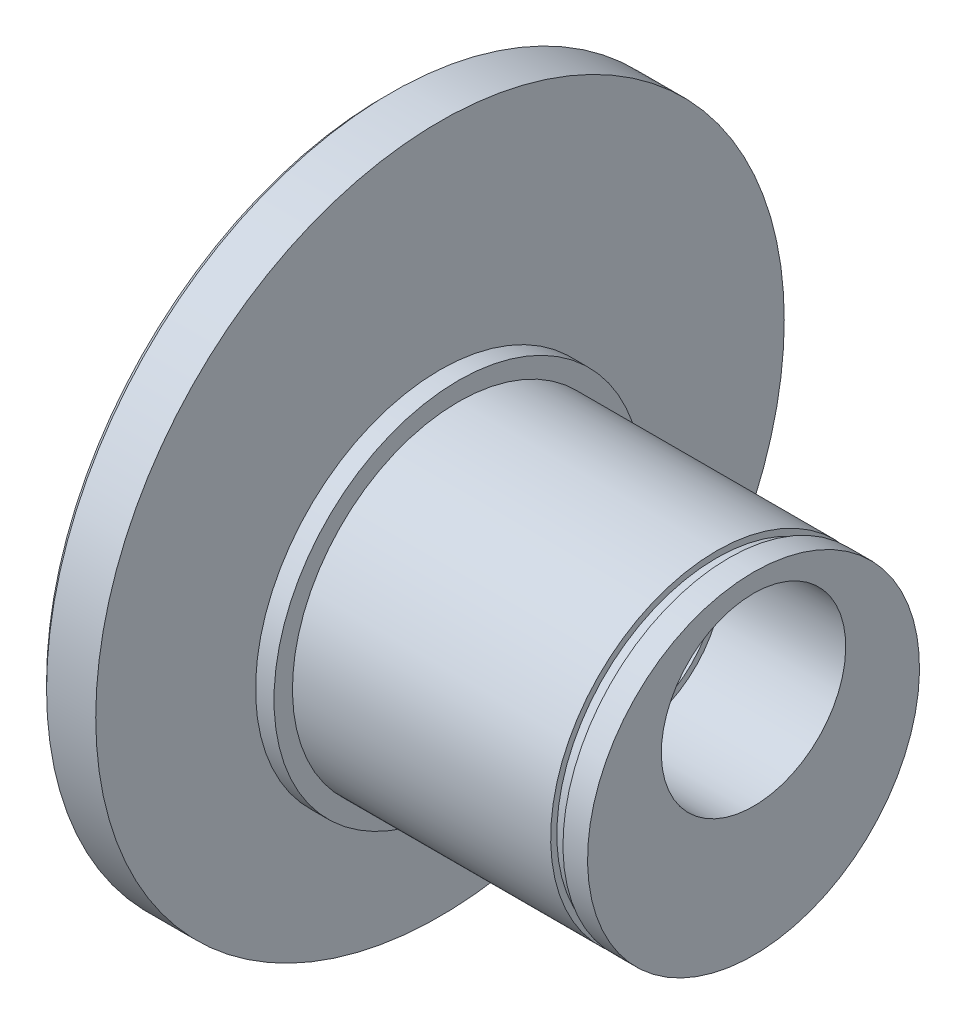
ISO-10303-21;
HEADER;
FILE_DESCRIPTION(('STEP AP214'),'2;1');
FILE_NAME('part.step','',(''),(''),'','','');
FILE_SCHEMA(('AUTOMOTIVE_DESIGN { 1 0 10303 214 1 1 1 1 }'));
ENDSEC;
DATA;
#1=APPLICATION_CONTEXT('core data for automotive mechanical design processes');
#2=APPLICATION_PROTOCOL_DEFINITION('international standard','automotive_design',2000,#1);
#3=PRODUCT_CONTEXT('',#1,'mechanical');
#4=PRODUCT('Part','Part','',(#3));
#5=PRODUCT_RELATED_PRODUCT_CATEGORY('part','',(#4));
#6=PRODUCT_DEFINITION_FORMATION('','',#4);
#7=PRODUCT_DEFINITION_CONTEXT('part definition',#1,'design');
#8=PRODUCT_DEFINITION('design','',#6,#7);
#9=PRODUCT_DEFINITION_SHAPE('','',#8);
#10=(LENGTH_UNIT() NAMED_UNIT(*) SI_UNIT(.MILLI.,.METRE.));
#11=(NAMED_UNIT(*) PLANE_ANGLE_UNIT() SI_UNIT($,.RADIAN.));
#12=(NAMED_UNIT(*) SI_UNIT($,.STERADIAN.) SOLID_ANGLE_UNIT());
#13=UNCERTAINTY_MEASURE_WITH_UNIT(LENGTH_MEASURE(1.E-05),#10,'distance_accuracy_value','');
#14=(GEOMETRIC_REPRESENTATION_CONTEXT(3) GLOBAL_UNCERTAINTY_ASSIGNED_CONTEXT((#13)) GLOBAL_UNIT_ASSIGNED_CONTEXT((#10,
#11,#12)) REPRESENTATION_CONTEXT('',''));
#15=CARTESIAN_POINT('',(0.,0.,0.));
#16=DIRECTION('',(0.,0.,1.));
#17=DIRECTION('',(1.,0.,0.));
#18=AXIS2_PLACEMENT_3D('',#15,#16,#17);
#19=CARTESIAN_POINT('',(65.,0.,0.));
#20=DIRECTION('',(-1.,0.,0.));
#21=DIRECTION('',(0.,0.,1.));
#22=AXIS2_PLACEMENT_3D('',#19,#20,#21);
#23=CYLINDRICAL_SURFACE('',#22,14.);
#24=CARTESIAN_POINT('',(30.,0.,0.));
#25=DIRECTION('',(-1.,0.,0.));
#26=DIRECTION('',(0.,0.,1.));
#27=AXIS2_PLACEMENT_3D('',#24,#25,#26);
#28=CIRCLE('',#27,14.);
#29=CARTESIAN_POINT('',(30.,0.,14.));
#30=VERTEX_POINT('',#29);
#31=EDGE_CURVE('E45',#30,#30,#28,.F.);
#32=ORIENTED_EDGE('',*,*,#31,.F.);
#33=EDGE_LOOP('',(#32));
#34=FACE_BOUND('',#33,.T.);
#35=CARTESIAN_POINT('',(45.,0.,0.));
#36=DIRECTION('',(1.,0.,0.));
#37=DIRECTION('',(0.,1.,0.));
#38=AXIS2_PLACEMENT_3D('',#35,#36,#37);
#39=CIRCLE('',#38,14.);
#40=CARTESIAN_POINT('',(45.,14.,0.));
#41=VERTEX_POINT('',#40);
#42=EDGE_CURVE('E33',#41,#41,#39,.F.);
#43=ORIENTED_EDGE('',*,*,#42,.F.);
#44=EDGE_LOOP('',(#43));
#45=FACE_BOUND('',#44,.T.);
#46=ADVANCED_FACE('F29',(#34,#45),#23,.F.);
#47=CARTESIAN_POINT('',(0.,0.,0.));
#48=DIRECTION('',(1.,0.,0.));
#49=DIRECTION('',(0.,0.,-1.));
#50=AXIS2_PLACEMENT_3D('',#47,#48,#49);
#51=PLANE('',#50);
#52=CARTESIAN_POINT('',(0.,0.,0.));
#53=DIRECTION('',(-1.,0.,0.));
#54=DIRECTION('',(0.,0.,1.));
#55=AXIS2_PLACEMENT_3D('',#52,#53,#54);
#56=CIRCLE('',#55,24.5);
#57=CARTESIAN_POINT('',(0.,0.,24.5));
#58=VERTEX_POINT('',#57);
#59=EDGE_CURVE('E85',#58,#58,#56,.T.);
#60=ORIENTED_EDGE('',*,*,#59,.F.);
#61=EDGE_LOOP('',(#60));
#62=FACE_BOUND('',#61,.T.);
#63=CARTESIAN_POINT('',(0.,0.,0.));
#64=DIRECTION('',(-1.,0.,0.));
#65=DIRECTION('',(0.,0.,1.));
#66=AXIS2_PLACEMENT_3D('',#63,#64,#65);
#67=CIRCLE('',#66,35.);
#68=CARTESIAN_POINT('',(0.,0.,35.));
#69=VERTEX_POINT('',#68);
#70=EDGE_CURVE('E10',#69,#69,#67,.T.);
#71=ORIENTED_EDGE('',*,*,#70,.T.);
#72=EDGE_LOOP('',(#71));
#73=FACE_BOUND('',#72,.T.);
#74=ADVANCED_FACE('F31',(#62,#73),#51,.F.);
#75=CARTESIAN_POINT('',(0.,0.,0.));
#76=DIRECTION('',(-1.,0.,0.));
#77=DIRECTION('',(0.,0.,1.));
#78=AXIS2_PLACEMENT_3D('',#75,#76,#77);
#79=CYLINDRICAL_SURFACE('',#78,35.);
#80=ORIENTED_EDGE('',*,*,#70,.F.);
#81=EDGE_LOOP('',(#80));
#82=FACE_BOUND('',#81,.T.);
#83=CARTESIAN_POINT('',(5.,0.,0.));
#84=DIRECTION('',(-1.,0.,0.));
#85=DIRECTION('',(0.,0.,1.));
#86=AXIS2_PLACEMENT_3D('',#83,#84,#85);
#87=CIRCLE('',#86,35.);
#88=CARTESIAN_POINT('',(5.,0.,35.));
#89=VERTEX_POINT('',#88);
#90=EDGE_CURVE('E37',#89,#89,#87,.T.);
#91=ORIENTED_EDGE('',*,*,#90,.T.);
#92=EDGE_LOOP('',(#91));
#93=FACE_BOUND('',#92,.T.);
#94=ADVANCED_FACE('F131',(#82,#93),#79,.T.);
#95=CARTESIAN_POINT('',(5.,35.,0.));
#96=DIRECTION('',(1.,0.,0.));
#97=DIRECTION('',(0.,0.,-1.));
#98=AXIS2_PLACEMENT_3D('',#95,#96,#97);
#99=PLANE('',#98);
#100=ORIENTED_EDGE('',*,*,#90,.F.);
#101=EDGE_LOOP('',(#100));
#102=FACE_BOUND('',#101,.T.);
#103=CARTESIAN_POINT('',(5.,0.,0.));
#104=DIRECTION('',(-1.,0.,0.));
#105=DIRECTION('',(0.,0.,1.));
#106=AXIS2_PLACEMENT_3D('',#103,#104,#105);
#107=CIRCLE('',#106,55.);
#108=CARTESIAN_POINT('',(5.,0.,55.));
#109=VERTEX_POINT('',#108);
#110=EDGE_CURVE('E42',#109,#109,#107,.T.);
#111=ORIENTED_EDGE('',*,*,#110,.T.);
#112=EDGE_LOOP('',(#111));
#113=FACE_BOUND('',#112,.T.);
#114=ADVANCED_FACE('F99',(#102,#113),#99,.F.);
#115=CARTESIAN_POINT('',(6.,0.,0.));
#116=DIRECTION('',(1.,0.,0.));
#117=DIRECTION('',(0.,0.,-1.));
#118=AXIS2_PLACEMENT_3D('',#115,#116,#117);
#119=CONICAL_SURFACE('',#118,56.,0.785398163397445);
#120=ORIENTED_EDGE('',*,*,#110,.F.);
#121=EDGE_LOOP('',(#120));
#122=FACE_BOUND('',#121,.T.);
#123=CARTESIAN_POINT('',(6.,0.,0.));
#124=DIRECTION('',(-1.,0.,0.));
#125=DIRECTION('',(0.,0.,1.));
#126=AXIS2_PLACEMENT_3D('',#123,#124,#125);
#127=CIRCLE('',#126,56.);
#128=CARTESIAN_POINT('',(6.,0.,56.));
#129=VERTEX_POINT('',#128);
#130=EDGE_CURVE('E94',#129,#129,#127,.T.);
#131=ORIENTED_EDGE('',*,*,#130,.T.);
#132=EDGE_LOOP('',(#131));
#133=FACE_BOUND('',#132,.T.);
#134=ADVANCED_FACE('F101',(#122,#133),#119,.T.);
#135=CARTESIAN_POINT('',(0.,0.,0.));
#136=DIRECTION('',(-1.,0.,0.));
#137=DIRECTION('',(0.,0.,1.));
#138=AXIS2_PLACEMENT_3D('',#135,#136,#137);
#139=CYLINDRICAL_SURFACE('',#138,56.);
#140=ORIENTED_EDGE('',*,*,#130,.F.);
#141=EDGE_LOOP('',(#140));
#142=FACE_BOUND('',#141,.T.);
#143=CARTESIAN_POINT('',(14.,0.,0.));
#144=DIRECTION('',(-1.,0.,0.));
#145=DIRECTION('',(0.,0.,1.));
#146=AXIS2_PLACEMENT_3D('',#143,#144,#145);
#147=CIRCLE('',#146,56.);
#148=CARTESIAN_POINT('',(14.,0.,56.));
#149=VERTEX_POINT('',#148);
#150=EDGE_CURVE('E89',#149,#149,#147,.T.);
#151=ORIENTED_EDGE('',*,*,#150,.T.);
#152=EDGE_LOOP('',(#151));
#153=FACE_BOUND('',#152,.T.);
#154=ADVANCED_FACE('F104',(#142,#153),#139,.T.);
#155=CARTESIAN_POINT('',(14.,56.,0.));
#156=DIRECTION('',(-1.,0.,0.));
#157=DIRECTION('',(0.,0.,1.));
#158=AXIS2_PLACEMENT_3D('',#155,#156,#157);
#159=PLANE('',#158);
#160=CARTESIAN_POINT('',(14.,-9.,0.));
#161=DIRECTION('',(1.,0.,0.));
#162=DIRECTION('',(0.,1.,0.));
#163=AXIS2_PLACEMENT_3D('',#160,#161,#162);
#164=CIRCLE('',#163,30.);
#165=CARTESIAN_POINT('',(14.,21.,0.));
#166=VERTEX_POINT('',#165);
#167=EDGE_CURVE('E82',#166,#166,#164,.T.);
#168=ORIENTED_EDGE('',*,*,#167,.F.);
#169=EDGE_LOOP('',(#168));
#170=FACE_BOUND('',#169,.T.);
#171=ORIENTED_EDGE('',*,*,#150,.F.);
#172=EDGE_LOOP('',(#171));
#173=FACE_BOUND('',#172,.T.);
#174=ADVANCED_FACE('F110',(#170,#173),#159,.F.);
#175=CARTESIAN_POINT('',(10.,0.,0.));
#176=DIRECTION('',(-1.,0.,0.));
#177=DIRECTION('',(0.,0.,1.));
#178=AXIS2_PLACEMENT_3D('',#175,#176,#177);
#179=CYLINDRICAL_SURFACE('',#178,24.5);
#180=CARTESIAN_POINT('',(10.,0.,0.));
#181=DIRECTION('',(-1.,0.,0.));
#182=DIRECTION('',(0.,0.,1.));
#183=AXIS2_PLACEMENT_3D('',#180,#181,#182);
#184=CIRCLE('',#183,24.5);
#185=CARTESIAN_POINT('',(10.,0.,24.5));
#186=VERTEX_POINT('',#185);
#187=EDGE_CURVE('E86',#186,#186,#184,.T.);
#188=ORIENTED_EDGE('',*,*,#187,.F.);
#189=EDGE_LOOP('',(#188));
#190=FACE_BOUND('',#189,.T.);
#191=ORIENTED_EDGE('',*,*,#59,.T.);
#192=EDGE_LOOP('',(#191));
#193=FACE_BOUND('',#192,.T.);
#194=ADVANCED_FACE('F115',(#190,#193),#179,.F.);
#195=CARTESIAN_POINT('',(10.,0.,0.));
#196=DIRECTION('',(-1.,0.,0.));
#197=DIRECTION('',(0.,0.,1.));
#198=AXIS2_PLACEMENT_3D('',#195,#196,#197);
#199=PLANE('',#198);
#200=CARTESIAN_POINT('',(10.,0.,0.));
#201=DIRECTION('',(-1.,0.,0.));
#202=DIRECTION('',(0.,0.,1.));
#203=AXIS2_PLACEMENT_3D('',#200,#201,#202);
#204=CIRCLE('',#203,15.);
#205=CARTESIAN_POINT('',(10.,0.,15.));
#206=VERTEX_POINT('',#205);
#207=EDGE_CURVE('E55',#206,#206,#204,.T.);
#208=ORIENTED_EDGE('',*,*,#207,.F.);
#209=EDGE_LOOP('',(#208));
#210=FACE_BOUND('',#209,.T.);
#211=ORIENTED_EDGE('',*,*,#187,.T.);
#212=EDGE_LOOP('',(#211));
#213=FACE_BOUND('',#212,.T.);
#214=ADVANCED_FACE('F121',(#210,#213),#199,.T.);
#215=CARTESIAN_POINT('',(58.5999429340862,-8.99999999999999,0.));
#216=DIRECTION('',(1.,0.,0.));
#217=DIRECTION('',(0.,1.,0.));
#218=AXIS2_PLACEMENT_3D('',#215,#216,#217);
#219=CYLINDRICAL_SURFACE('',#218,30.);
#220=ORIENTED_EDGE('',*,*,#167,.T.);
#221=EDGE_LOOP('',(#220));
#222=FACE_BOUND('',#221,.T.);
#223=CARTESIAN_POINT('',(17.,-9.,0.));
#224=DIRECTION('',(1.,0.,0.));
#225=DIRECTION('',(0.,1.,0.));
#226=AXIS2_PLACEMENT_3D('',#223,#224,#225);
#227=CIRCLE('',#226,30.);
#228=CARTESIAN_POINT('',(17.,21.,0.));
#229=VERTEX_POINT('',#228);
#230=EDGE_CURVE('E79',#229,#229,#227,.T.);
#231=ORIENTED_EDGE('',*,*,#230,.F.);
#232=EDGE_LOOP('',(#231));
#233=FACE_BOUND('',#232,.T.);
#234=ADVANCED_FACE('F166',(#222,#233),#219,.T.);
#235=CARTESIAN_POINT('',(17.,21.,0.));
#236=DIRECTION('',(1.,0.,0.));
#237=DIRECTION('',(0.,1.,0.));
#238=AXIS2_PLACEMENT_3D('',#235,#236,#237);
#239=PLANE('',#238);
#240=ORIENTED_EDGE('',*,*,#230,.T.);
#241=EDGE_LOOP('',(#240));
#242=FACE_BOUND('',#241,.T.);
#243=CARTESIAN_POINT('',(17.,-9.,0.));
#244=DIRECTION('',(1.,0.,0.));
#245=DIRECTION('',(0.,1.,0.));
#246=AXIS2_PLACEMENT_3D('',#243,#244,#245);
#247=CIRCLE('',#246,27.);
#248=CARTESIAN_POINT('',(17.,18.,0.));
#249=VERTEX_POINT('',#248);
#250=EDGE_CURVE('E76',#249,#249,#247,.T.);
#251=ORIENTED_EDGE('',*,*,#250,.F.);
#252=EDGE_LOOP('',(#251));
#253=FACE_BOUND('',#252,.T.);
#254=ADVANCED_FACE('F162',(#242,#253),#239,.T.);
#255=CARTESIAN_POINT('',(58.5999429340862,-8.99999999999999,0.));
#256=DIRECTION('',(1.,0.,0.));
#257=DIRECTION('',(0.,1.,0.));
#258=AXIS2_PLACEMENT_3D('',#255,#256,#257);
#259=CYLINDRICAL_SURFACE('',#258,27.);
#260=ORIENTED_EDGE('',*,*,#250,.T.);
#261=EDGE_LOOP('',(#260));
#262=FACE_BOUND('',#261,.T.);
#263=CARTESIAN_POINT('',(59.,-8.99999999999999,0.));
#264=DIRECTION('',(1.,0.,0.));
#265=DIRECTION('',(0.,1.,0.));
#266=AXIS2_PLACEMENT_3D('',#263,#264,#265);
#267=CIRCLE('',#266,27.);
#268=CARTESIAN_POINT('',(59.,18.,0.));
#269=VERTEX_POINT('',#268);
#270=EDGE_CURVE('E73',#269,#269,#267,.T.);
#271=ORIENTED_EDGE('',*,*,#270,.F.);
#272=EDGE_LOOP('',(#271));
#273=FACE_BOUND('',#272,.T.);
#274=ADVANCED_FACE('F158',(#262,#273),#259,.T.);
#275=CARTESIAN_POINT('',(59.,18.,0.));
#276=DIRECTION('',(1.,0.,0.));
#277=DIRECTION('',(0.,1.,0.));
#278=AXIS2_PLACEMENT_3D('',#275,#276,#277);
#279=PLANE('',#278);
#280=ORIENTED_EDGE('',*,*,#270,.T.);
#281=EDGE_LOOP('',(#280));
#282=FACE_BOUND('',#281,.T.);
#283=CARTESIAN_POINT('',(59.,-8.99999999999999,0.));
#284=DIRECTION('',(1.,0.,0.));
#285=DIRECTION('',(0.,1.,0.));
#286=AXIS2_PLACEMENT_3D('',#283,#284,#285);
#287=CIRCLE('',#286,26.);
#288=CARTESIAN_POINT('',(59.,17.,0.));
#289=VERTEX_POINT('',#288);
#290=EDGE_CURVE('E70',#289,#289,#287,.T.);
#291=ORIENTED_EDGE('',*,*,#290,.F.);
#292=EDGE_LOOP('',(#291));
#293=FACE_BOUND('',#292,.T.);
#294=ADVANCED_FACE('F154',(#282,#293),#279,.T.);
#295=CARTESIAN_POINT('',(58.5999429340862,-8.99999999999999,0.));
#296=DIRECTION('',(1.,0.,0.));
#297=DIRECTION('',(0.,1.,0.));
#298=AXIS2_PLACEMENT_3D('',#295,#296,#297);
#299=CYLINDRICAL_SURFACE('',#298,26.);
#300=ORIENTED_EDGE('',*,*,#290,.T.);
#301=EDGE_LOOP('',(#300));
#302=FACE_BOUND('',#301,.T.);
#303=CARTESIAN_POINT('',(61.,-8.99999999999999,0.));
#304=DIRECTION('',(1.,0.,0.));
#305=DIRECTION('',(0.,1.,0.));
#306=AXIS2_PLACEMENT_3D('',#303,#304,#305);
#307=CIRCLE('',#306,26.);
#308=CARTESIAN_POINT('',(61.,17.,0.));
#309=VERTEX_POINT('',#308);
#310=EDGE_CURVE('E67',#309,#309,#307,.T.);
#311=ORIENTED_EDGE('',*,*,#310,.F.);
#312=EDGE_LOOP('',(#311));
#313=FACE_BOUND('',#312,.T.);
#314=ADVANCED_FACE('F150',(#302,#313),#299,.T.);
#315=CARTESIAN_POINT('',(61.,17.,0.));
#316=DIRECTION('',(-1.,0.,0.));
#317=DIRECTION('',(0.,-1.,0.));
#318=AXIS2_PLACEMENT_3D('',#315,#316,#317);
#319=PLANE('',#318);
#320=ORIENTED_EDGE('',*,*,#310,.T.);
#321=EDGE_LOOP('',(#320));
#322=FACE_BOUND('',#321,.T.);
#323=CARTESIAN_POINT('',(61.,-8.99999999999999,0.));
#324=DIRECTION('',(1.,0.,0.));
#325=DIRECTION('',(0.,1.,0.));
#326=AXIS2_PLACEMENT_3D('',#323,#324,#325);
#327=CIRCLE('',#326,27.);
#328=CARTESIAN_POINT('',(61.,18.,0.));
#329=VERTEX_POINT('',#328);
#330=EDGE_CURVE('E52',#329,#329,#327,.T.);
#331=ORIENTED_EDGE('',*,*,#330,.F.);
#332=EDGE_LOOP('',(#331));
#333=FACE_BOUND('',#332,.T.);
#334=ADVANCED_FACE('F146',(#322,#333),#319,.T.);
#335=CARTESIAN_POINT('',(58.5999429340862,-8.99999999999999,0.));
#336=DIRECTION('',(1.,0.,0.));
#337=DIRECTION('',(0.,1.,0.));
#338=AXIS2_PLACEMENT_3D('',#335,#336,#337);
#339=CYLINDRICAL_SURFACE('',#338,27.);
#340=ORIENTED_EDGE('',*,*,#330,.T.);
#341=EDGE_LOOP('',(#340));
#342=FACE_BOUND('',#341,.T.);
#343=CARTESIAN_POINT('',(65.,-8.99999999999999,0.));
#344=DIRECTION('',(1.,0.,0.));
#345=DIRECTION('',(0.,1.,0.));
#346=AXIS2_PLACEMENT_3D('',#343,#344,#345);
#347=CIRCLE('',#346,27.);
#348=CARTESIAN_POINT('',(65.,18.,0.));
#349=VERTEX_POINT('',#348);
#350=EDGE_CURVE('E47',#349,#349,#347,.T.);
#351=ORIENTED_EDGE('',*,*,#350,.F.);
#352=EDGE_LOOP('',(#351));
#353=FACE_BOUND('',#352,.T.);
#354=ADVANCED_FACE('F142',(#342,#353),#339,.T.);
#355=CARTESIAN_POINT('',(65.,18.,0.));
#356=DIRECTION('',(1.,0.,0.));
#357=DIRECTION('',(0.,1.,0.));
#358=AXIS2_PLACEMENT_3D('',#355,#356,#357);
#359=PLANE('',#358);
#360=CARTESIAN_POINT('',(65.,0.,0.));
#361=DIRECTION('',(1.,0.,0.));
#362=DIRECTION('',(0.,1.,0.));
#363=AXIS2_PLACEMENT_3D('',#360,#361,#362);
#364=CIRCLE('',#363,15.);
#365=CARTESIAN_POINT('',(65.,15.,0.));
#366=VERTEX_POINT('',#365);
#367=EDGE_CURVE('E62',#366,#366,#364,.T.);
#368=ORIENTED_EDGE('',*,*,#367,.F.);
#369=EDGE_LOOP('',(#368));
#370=FACE_BOUND('',#369,.T.);
#371=ORIENTED_EDGE('',*,*,#350,.T.);
#372=EDGE_LOOP('',(#371));
#373=FACE_BOUND('',#372,.T.);
#374=ADVANCED_FACE('F138',(#370,#373),#359,.T.);
#375=CARTESIAN_POINT('',(30.,0.,0.));
#376=DIRECTION('',(-1.,0.,0.));
#377=DIRECTION('',(0.,0.,1.));
#378=AXIS2_PLACEMENT_3D('',#375,#376,#377);
#379=PLANE('',#378);
#380=CARTESIAN_POINT('',(30.,0.,0.));
#381=DIRECTION('',(-1.,0.,0.));
#382=DIRECTION('',(0.,0.,1.));
#383=AXIS2_PLACEMENT_3D('',#380,#381,#382);
#384=CIRCLE('',#383,15.);
#385=CARTESIAN_POINT('',(30.,0.,15.));
#386=VERTEX_POINT('',#385);
#387=EDGE_CURVE('E48',#386,#386,#384,.T.);
#388=ORIENTED_EDGE('',*,*,#387,.T.);
#389=EDGE_LOOP('',(#388));
#390=FACE_BOUND('',#389,.T.);
#391=ORIENTED_EDGE('',*,*,#31,.T.);
#392=EDGE_LOOP('',(#391));
#393=FACE_BOUND('',#392,.T.);
#394=ADVANCED_FACE('F141',(#390,#393),#379,.T.);
#395=CARTESIAN_POINT('',(30.,0.,0.));
#396=DIRECTION('',(-1.,0.,0.));
#397=DIRECTION('',(0.,0.,1.));
#398=AXIS2_PLACEMENT_3D('',#395,#396,#397);
#399=CYLINDRICAL_SURFACE('',#398,15.);
#400=ORIENTED_EDGE('',*,*,#387,.F.);
#401=EDGE_LOOP('',(#400));
#402=FACE_BOUND('',#401,.T.);
#403=ORIENTED_EDGE('',*,*,#207,.T.);
#404=EDGE_LOOP('',(#403));
#405=FACE_BOUND('',#404,.T.);
#406=ADVANCED_FACE('F136',(#402,#405),#399,.F.);
#407=CARTESIAN_POINT('',(45.,0.,0.));
#408=DIRECTION('',(1.,0.,0.));
#409=DIRECTION('',(0.,1.,0.));
#410=AXIS2_PLACEMENT_3D('',#407,#408,#409);
#411=PLANE('',#410);
#412=CARTESIAN_POINT('',(45.,0.,0.));
#413=DIRECTION('',(1.,0.,0.));
#414=DIRECTION('',(0.,1.,0.));
#415=AXIS2_PLACEMENT_3D('',#412,#413,#414);
#416=CIRCLE('',#415,15.);
#417=CARTESIAN_POINT('',(45.,15.,0.));
#418=VERTEX_POINT('',#417);
#419=EDGE_CURVE('E201',#418,#418,#416,.T.);
#420=ORIENTED_EDGE('',*,*,#419,.T.);
#421=EDGE_LOOP('',(#420));
#422=FACE_BOUND('',#421,.T.);
#423=ORIENTED_EDGE('',*,*,#42,.T.);
#424=EDGE_LOOP('',(#423));
#425=FACE_BOUND('',#424,.T.);
#426=ADVANCED_FACE('F182',(#422,#425),#411,.T.);
#427=CARTESIAN_POINT('',(45.,0.,0.));
#428=DIRECTION('',(1.,0.,0.));
#429=DIRECTION('',(0.,1.,0.));
#430=AXIS2_PLACEMENT_3D('',#427,#428,#429);
#431=CYLINDRICAL_SURFACE('',#430,15.);
#432=ORIENTED_EDGE('',*,*,#419,.F.);
#433=EDGE_LOOP('',(#432));
#434=FACE_BOUND('',#433,.T.);
#435=ORIENTED_EDGE('',*,*,#367,.T.);
#436=EDGE_LOOP('',(#435));
#437=FACE_BOUND('',#436,.T.);
#438=ADVANCED_FACE('F188',(#434,#437),#431,.F.);
#439=CLOSED_SHELL('',(#46,#74,#94,#114,#134,#154,#174,#194,#214,#234,#254,#274,#294,#314,#334,
#354,#374,#394,#406,#426,#438));
#440=MANIFOLD_SOLID_BREP('B2',#439);
#441=ADVANCED_BREP_SHAPE_REPRESENTATION('',(#18,#440),#14);
#442=SHAPE_DEFINITION_REPRESENTATION(#9,#441);
ENDSEC;
END-ISO-10303-21;
